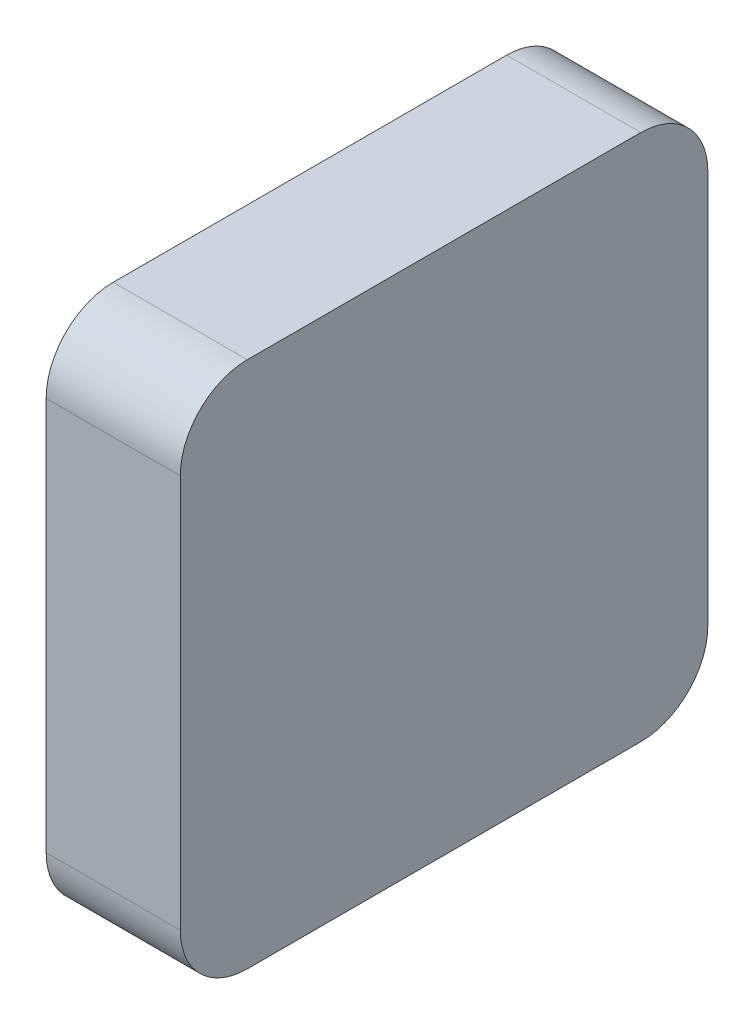
ISO-10303-21;
HEADER;
FILE_DESCRIPTION(('STEP AP214'),'2;1');
FILE_NAME('part.step','',(''),(''),'','','');
FILE_SCHEMA(('AUTOMOTIVE_DESIGN { 1 0 10303 214 1 1 1 1 }'));
ENDSEC;
DATA;
#1=APPLICATION_CONTEXT('core data for automotive mechanical design processes');
#2=APPLICATION_PROTOCOL_DEFINITION('international standard','automotive_design',2000,#1);
#3=PRODUCT_CONTEXT('',#1,'mechanical');
#4=PRODUCT('Part','Part','',(#3));
#5=PRODUCT_RELATED_PRODUCT_CATEGORY('part','',(#4));
#6=PRODUCT_DEFINITION_FORMATION('','',#4);
#7=PRODUCT_DEFINITION_CONTEXT('part definition',#1,'design');
#8=PRODUCT_DEFINITION('design','',#6,#7);
#9=PRODUCT_DEFINITION_SHAPE('','',#8);
#10=(LENGTH_UNIT() NAMED_UNIT(*) SI_UNIT(.MILLI.,.METRE.));
#11=(NAMED_UNIT(*) PLANE_ANGLE_UNIT() SI_UNIT($,.RADIAN.));
#12=(NAMED_UNIT(*) SI_UNIT($,.STERADIAN.) SOLID_ANGLE_UNIT());
#13=UNCERTAINTY_MEASURE_WITH_UNIT(LENGTH_MEASURE(1.E-05),#10,'distance_accuracy_value','');
#14=(GEOMETRIC_REPRESENTATION_CONTEXT(3) GLOBAL_UNCERTAINTY_ASSIGNED_CONTEXT((#13)) GLOBAL_UNIT_ASSIGNED_CONTEXT((#10,
#11,#12)) REPRESENTATION_CONTEXT('',''));
#15=CARTESIAN_POINT('',(0.,0.,0.));
#16=DIRECTION('',(0.,0.,1.));
#17=DIRECTION('',(1.,0.,0.));
#18=AXIS2_PLACEMENT_3D('',#15,#16,#17);
#19=CARTESIAN_POINT('',(7.62,-11.176,-11.176));
#20=DIRECTION('',(-1.,0.,0.));
#21=DIRECTION('',(0.,0.,1.));
#22=AXIS2_PLACEMENT_3D('',#19,#20,#21);
#23=CYLINDRICAL_SURFACE('',#22,3.81);
#24=CARTESIAN_POINT('',(0.,-11.176,-11.176));
#25=DIRECTION('',(1.,0.,0.));
#26=DIRECTION('',(0.,0.,1.));
#27=AXIS2_PLACEMENT_3D('',#24,#25,#26);
#28=CIRCLE('',#27,3.81);
#29=CARTESIAN_POINT('',(0.,-14.986,-11.176));
#30=VERTEX_POINT('',#29);
#31=CARTESIAN_POINT('',(0.,-11.176,-14.986));
#32=VERTEX_POINT('',#31);
#33=EDGE_CURVE('E146',#30,#32,#28,.T.);
#34=ORIENTED_EDGE('',*,*,#33,.T.);
#35=DIRECTION('',(-1.,0.,0.));
#36=VECTOR('',#35,1.);
#37=CARTESIAN_POINT('',(7.62,-11.176,-14.986));
#38=LINE('',#37,#36);
#39=CARTESIAN_POINT('',(7.62,-11.176,-14.986));
#40=VERTEX_POINT('',#39);
#41=EDGE_CURVE('E11',#40,#32,#38,.T.);
#42=ORIENTED_EDGE('',*,*,#41,.F.);
#43=CARTESIAN_POINT('',(7.62,-11.176,-11.176));
#44=DIRECTION('',(1.,0.,0.));
#45=DIRECTION('',(0.,0.,1.));
#46=AXIS2_PLACEMENT_3D('',#43,#44,#45);
#47=CIRCLE('',#46,3.81);
#48=CARTESIAN_POINT('',(7.62,-14.986,-11.176));
#49=VERTEX_POINT('',#48);
#50=EDGE_CURVE('E168',#49,#40,#47,.T.);
#51=ORIENTED_EDGE('',*,*,#50,.F.);
#52=DIRECTION('',(-1.,0.,0.));
#53=VECTOR('',#52,1.);
#54=CARTESIAN_POINT('',(7.62,-14.986,-11.176));
#55=LINE('',#54,#53);
#56=EDGE_CURVE('E142',#49,#30,#55,.T.);
#57=ORIENTED_EDGE('',*,*,#56,.T.);
#58=EDGE_LOOP('',(#34,#42,#51,#57));
#59=FACE_BOUND('',#58,.T.);
#60=ADVANCED_FACE('F45',(#59),#23,.T.);
#61=CARTESIAN_POINT('',(7.62,-11.176,-14.986));
#62=DIRECTION('',(0.,0.,1.));
#63=DIRECTION('',(1.,0.,0.));
#64=AXIS2_PLACEMENT_3D('',#61,#62,#63);
#65=PLANE('',#64);
#66=DIRECTION('',(0.,1.,0.));
#67=VECTOR('',#66,1.);
#68=CARTESIAN_POINT('',(0.,-11.176,-14.986));
#69=LINE('',#68,#67);
#70=CARTESIAN_POINT('',(0.,11.176,-14.986));
#71=VERTEX_POINT('',#70);
#72=EDGE_CURVE('E150',#32,#71,#69,.T.);
#73=ORIENTED_EDGE('',*,*,#72,.T.);
#74=DIRECTION('',(-1.,0.,0.));
#75=VECTOR('',#74,1.);
#76=CARTESIAN_POINT('',(7.62,11.176,-14.986));
#77=LINE('',#76,#75);
#78=CARTESIAN_POINT('',(7.62,11.176,-14.986));
#79=VERTEX_POINT('',#78);
#80=EDGE_CURVE('E54',#79,#71,#77,.T.);
#81=ORIENTED_EDGE('',*,*,#80,.F.);
#82=DIRECTION('',(0.,1.,0.));
#83=VECTOR('',#82,1.);
#84=CARTESIAN_POINT('',(7.62,-11.176,-14.986));
#85=LINE('',#84,#83);
#86=EDGE_CURVE('E105',#40,#79,#85,.T.);
#87=ORIENTED_EDGE('',*,*,#86,.F.);
#88=ORIENTED_EDGE('',*,*,#41,.T.);
#89=EDGE_LOOP('',(#73,#81,#87,#88));
#90=FACE_BOUND('',#89,.T.);
#91=ADVANCED_FACE('F214',(#90),#65,.F.);
#92=CARTESIAN_POINT('',(7.62,11.176,-11.176));
#93=DIRECTION('',(-1.,0.,0.));
#94=DIRECTION('',(0.,0.,1.));
#95=AXIS2_PLACEMENT_3D('',#92,#93,#94);
#96=CYLINDRICAL_SURFACE('',#95,3.81);
#97=CARTESIAN_POINT('',(0.,11.176,-11.176));
#98=DIRECTION('',(1.,0.,0.));
#99=DIRECTION('',(0.,0.,-1.));
#100=AXIS2_PLACEMENT_3D('',#97,#98,#99);
#101=CIRCLE('',#100,3.81);
#102=CARTESIAN_POINT('',(0.,14.986,-11.176));
#103=VERTEX_POINT('',#102);
#104=EDGE_CURVE('E153',#71,#103,#101,.T.);
#105=ORIENTED_EDGE('',*,*,#104,.T.);
#106=DIRECTION('',(-1.,0.,0.));
#107=VECTOR('',#106,1.);
#108=CARTESIAN_POINT('',(7.62,14.986,-11.176));
#109=LINE('',#108,#107);
#110=CARTESIAN_POINT('',(7.62,14.986,-11.176));
#111=VERTEX_POINT('',#110);
#112=EDGE_CURVE('E179',#111,#103,#109,.T.);
#113=ORIENTED_EDGE('',*,*,#112,.F.);
#114=CARTESIAN_POINT('',(7.62,11.176,-11.176));
#115=DIRECTION('',(1.,0.,0.));
#116=DIRECTION('',(0.,0.,-1.));
#117=AXIS2_PLACEMENT_3D('',#114,#115,#116);
#118=CIRCLE('',#117,3.81);
#119=EDGE_CURVE('E189',#79,#111,#118,.T.);
#120=ORIENTED_EDGE('',*,*,#119,.F.);
#121=ORIENTED_EDGE('',*,*,#80,.T.);
#122=EDGE_LOOP('',(#105,#113,#120,#121));
#123=FACE_BOUND('',#122,.T.);
#124=ADVANCED_FACE('F187',(#123),#96,.T.);
#125=CARTESIAN_POINT('',(7.62,14.986,-11.176));
#126=DIRECTION('',(0.,-1.,0.));
#127=DIRECTION('',(0.,0.,-1.));
#128=AXIS2_PLACEMENT_3D('',#125,#126,#127);
#129=PLANE('',#128);
#130=DIRECTION('',(0.,0.,1.));
#131=VECTOR('',#130,1.);
#132=CARTESIAN_POINT('',(0.,14.986,-11.176));
#133=LINE('',#132,#131);
#134=CARTESIAN_POINT('',(0.,14.986,11.176));
#135=VERTEX_POINT('',#134);
#136=EDGE_CURVE('E156',#103,#135,#133,.T.);
#137=ORIENTED_EDGE('',*,*,#136,.T.);
#138=DIRECTION('',(-1.,0.,0.));
#139=VECTOR('',#138,1.);
#140=CARTESIAN_POINT('',(7.62,14.986,11.176));
#141=LINE('',#140,#139);
#142=CARTESIAN_POINT('',(7.62,14.986,11.176));
#143=VERTEX_POINT('',#142);
#144=EDGE_CURVE('E175',#143,#135,#141,.T.);
#145=ORIENTED_EDGE('',*,*,#144,.F.);
#146=DIRECTION('',(0.,0.,1.));
#147=VECTOR('',#146,1.);
#148=CARTESIAN_POINT('',(7.62,14.986,-11.176));
#149=LINE('',#148,#147);
#150=EDGE_CURVE('E202',#111,#143,#149,.T.);
#151=ORIENTED_EDGE('',*,*,#150,.F.);
#152=ORIENTED_EDGE('',*,*,#112,.T.);
#153=EDGE_LOOP('',(#137,#145,#151,#152));
#154=FACE_BOUND('',#153,.T.);
#155=ADVANCED_FACE('F197',(#154),#129,.F.);
#156=CARTESIAN_POINT('',(7.62,11.176,11.176));
#157=DIRECTION('',(-1.,0.,0.));
#158=DIRECTION('',(0.,0.,1.));
#159=AXIS2_PLACEMENT_3D('',#156,#157,#158);
#160=CYLINDRICAL_SURFACE('',#159,3.81);
#161=CARTESIAN_POINT('',(0.,11.176,11.176));
#162=DIRECTION('',(1.,0.,0.));
#163=DIRECTION('',(0.,0.,1.));
#164=AXIS2_PLACEMENT_3D('',#161,#162,#163);
#165=CIRCLE('',#164,3.81);
#166=CARTESIAN_POINT('',(0.,11.176,14.986));
#167=VERTEX_POINT('',#166);
#168=EDGE_CURVE('E159',#135,#167,#165,.T.);
#169=ORIENTED_EDGE('',*,*,#168,.T.);
#170=DIRECTION('',(-1.,0.,0.));
#171=VECTOR('',#170,1.);
#172=CARTESIAN_POINT('',(7.62,11.176,14.986));
#173=LINE('',#172,#171);
#174=CARTESIAN_POINT('',(7.62,11.176,14.986));
#175=VERTEX_POINT('',#174);
#176=EDGE_CURVE('E135',#175,#167,#173,.T.);
#177=ORIENTED_EDGE('',*,*,#176,.F.);
#178=CARTESIAN_POINT('',(7.62,11.176,11.176));
#179=DIRECTION('',(1.,0.,0.));
#180=DIRECTION('',(0.,0.,1.));
#181=AXIS2_PLACEMENT_3D('',#178,#179,#180);
#182=CIRCLE('',#181,3.81);
#183=EDGE_CURVE('E124',#143,#175,#182,.T.);
#184=ORIENTED_EDGE('',*,*,#183,.F.);
#185=ORIENTED_EDGE('',*,*,#144,.T.);
#186=EDGE_LOOP('',(#169,#177,#184,#185));
#187=FACE_BOUND('',#186,.T.);
#188=ADVANCED_FACE('F200',(#187),#160,.T.);
#189=CARTESIAN_POINT('',(7.62,-11.176,14.986));
#190=DIRECTION('',(0.,0.,-1.));
#191=DIRECTION('',(-1.,0.,0.));
#192=AXIS2_PLACEMENT_3D('',#189,#190,#191);
#193=PLANE('',#192);
#194=DIRECTION('',(0.,-1.,0.));
#195=VECTOR('',#194,1.);
#196=CARTESIAN_POINT('',(0.,-11.176,14.986));
#197=LINE('',#196,#195);
#198=CARTESIAN_POINT('',(0.,-11.176,14.986));
#199=VERTEX_POINT('',#198);
#200=EDGE_CURVE('E133',#167,#199,#197,.T.);
#201=ORIENTED_EDGE('',*,*,#200,.T.);
#202=DIRECTION('',(-1.,0.,0.));
#203=VECTOR('',#202,1.);
#204=CARTESIAN_POINT('',(7.62,-11.176,14.986));
#205=LINE('',#204,#203);
#206=CARTESIAN_POINT('',(7.62,-11.176,14.986));
#207=VERTEX_POINT('',#206);
#208=EDGE_CURVE('E130',#207,#199,#205,.T.);
#209=ORIENTED_EDGE('',*,*,#208,.F.);
#210=DIRECTION('',(0.,-1.,0.));
#211=VECTOR('',#210,1.);
#212=CARTESIAN_POINT('',(7.62,-11.176,14.986));
#213=LINE('',#212,#211);
#214=EDGE_CURVE('E118',#175,#207,#213,.T.);
#215=ORIENTED_EDGE('',*,*,#214,.F.);
#216=ORIENTED_EDGE('',*,*,#176,.T.);
#217=EDGE_LOOP('',(#201,#209,#215,#216));
#218=FACE_BOUND('',#217,.T.);
#219=ADVANCED_FACE('F131',(#218),#193,.F.);
#220=CARTESIAN_POINT('',(7.62,-11.176,11.176));
#221=DIRECTION('',(-1.,0.,0.));
#222=DIRECTION('',(0.,0.,1.));
#223=AXIS2_PLACEMENT_3D('',#220,#221,#222);
#224=CYLINDRICAL_SURFACE('',#223,3.81);
#225=CARTESIAN_POINT('',(0.,-11.176,11.176));
#226=DIRECTION('',(1.,0.,0.));
#227=DIRECTION('',(0.,0.,1.));
#228=AXIS2_PLACEMENT_3D('',#225,#226,#227);
#229=CIRCLE('',#228,3.81);
#230=CARTESIAN_POINT('',(0.,-14.986,11.176));
#231=VERTEX_POINT('',#230);
#232=EDGE_CURVE('E91',#199,#231,#229,.T.);
#233=ORIENTED_EDGE('',*,*,#232,.T.);
#234=DIRECTION('',(-1.,0.,0.));
#235=VECTOR('',#234,1.);
#236=CARTESIAN_POINT('',(7.62,-14.986,11.176));
#237=LINE('',#236,#235);
#238=CARTESIAN_POINT('',(7.62,-14.986,11.176));
#239=VERTEX_POINT('',#238);
#240=EDGE_CURVE('E136',#239,#231,#237,.T.);
#241=ORIENTED_EDGE('',*,*,#240,.F.);
#242=CARTESIAN_POINT('',(7.62,-11.176,11.176));
#243=DIRECTION('',(1.,0.,0.));
#244=DIRECTION('',(0.,0.,1.));
#245=AXIS2_PLACEMENT_3D('',#242,#243,#244);
#246=CIRCLE('',#245,3.81);
#247=EDGE_CURVE('E122',#207,#239,#246,.T.);
#248=ORIENTED_EDGE('',*,*,#247,.F.);
#249=ORIENTED_EDGE('',*,*,#208,.T.);
#250=EDGE_LOOP('',(#233,#241,#248,#249));
#251=FACE_BOUND('',#250,.T.);
#252=ADVANCED_FACE('F138',(#251),#224,.T.);
#253=CARTESIAN_POINT('',(7.62,-14.986,-11.176));
#254=DIRECTION('',(0.,1.,0.));
#255=DIRECTION('',(0.,0.,1.));
#256=AXIS2_PLACEMENT_3D('',#253,#254,#255);
#257=PLANE('',#256);
#258=DIRECTION('',(0.,0.,-1.));
#259=VECTOR('',#258,1.);
#260=CARTESIAN_POINT('',(0.,-14.986,-11.176));
#261=LINE('',#260,#259);
#262=EDGE_CURVE('E97',#231,#30,#261,.T.);
#263=ORIENTED_EDGE('',*,*,#262,.T.);
#264=ORIENTED_EDGE('',*,*,#56,.F.);
#265=DIRECTION('',(0.,0.,-1.));
#266=VECTOR('',#265,1.);
#267=CARTESIAN_POINT('',(7.62,-14.986,-11.176));
#268=LINE('',#267,#266);
#269=EDGE_CURVE('E62',#239,#49,#268,.T.);
#270=ORIENTED_EDGE('',*,*,#269,.F.);
#271=ORIENTED_EDGE('',*,*,#240,.T.);
#272=EDGE_LOOP('',(#263,#264,#270,#271));
#273=FACE_BOUND('',#272,.T.);
#274=ADVANCED_FACE('F230',(#273),#257,.F.);
#275=CARTESIAN_POINT('',(7.62,-11.176,-11.176));
#276=DIRECTION('',(-1.,0.,0.));
#277=DIRECTION('',(0.,0.,1.));
#278=AXIS2_PLACEMENT_3D('',#275,#276,#277);
#279=PLANE('',#278);
#280=ORIENTED_EDGE('',*,*,#50,.T.);
#281=ORIENTED_EDGE('',*,*,#86,.T.);
#282=ORIENTED_EDGE('',*,*,#119,.T.);
#283=ORIENTED_EDGE('',*,*,#150,.T.);
#284=ORIENTED_EDGE('',*,*,#183,.T.);
#285=ORIENTED_EDGE('',*,*,#214,.T.);
#286=ORIENTED_EDGE('',*,*,#247,.T.);
#287=ORIENTED_EDGE('',*,*,#269,.T.);
#288=EDGE_LOOP('',(#280,#281,#282,#283,#284,#285,#286,#287));
#289=FACE_BOUND('',#288,.T.);
#290=ADVANCED_FACE('F120',(#289),#279,.F.);
#291=CARTESIAN_POINT('',(0.,-11.176,-11.176));
#292=DIRECTION('',(-1.,0.,0.));
#293=DIRECTION('',(0.,0.,1.));
#294=AXIS2_PLACEMENT_3D('',#291,#292,#293);
#295=PLANE('',#294);
#296=ORIENTED_EDGE('',*,*,#33,.F.);
#297=ORIENTED_EDGE('',*,*,#262,.F.);
#298=ORIENTED_EDGE('',*,*,#232,.F.);
#299=ORIENTED_EDGE('',*,*,#200,.F.);
#300=ORIENTED_EDGE('',*,*,#168,.F.);
#301=ORIENTED_EDGE('',*,*,#136,.F.);
#302=ORIENTED_EDGE('',*,*,#104,.F.);
#303=ORIENTED_EDGE('',*,*,#72,.F.);
#304=EDGE_LOOP('',(#296,#297,#298,#299,#300,#301,#302,#303));
#305=FACE_BOUND('',#304,.T.);
#306=ADVANCED_FACE('F193',(#305),#295,.T.);
#307=CLOSED_SHELL('',(#60,#91,#124,#155,#188,#219,#252,#274,#290,#306));
#308=MANIFOLD_SOLID_BREP('B2',#307);
#309=ADVANCED_BREP_SHAPE_REPRESENTATION('',(#18,#308),#14);
#310=SHAPE_DEFINITION_REPRESENTATION(#9,#309);
ENDSEC;
END-ISO-10303-21;
